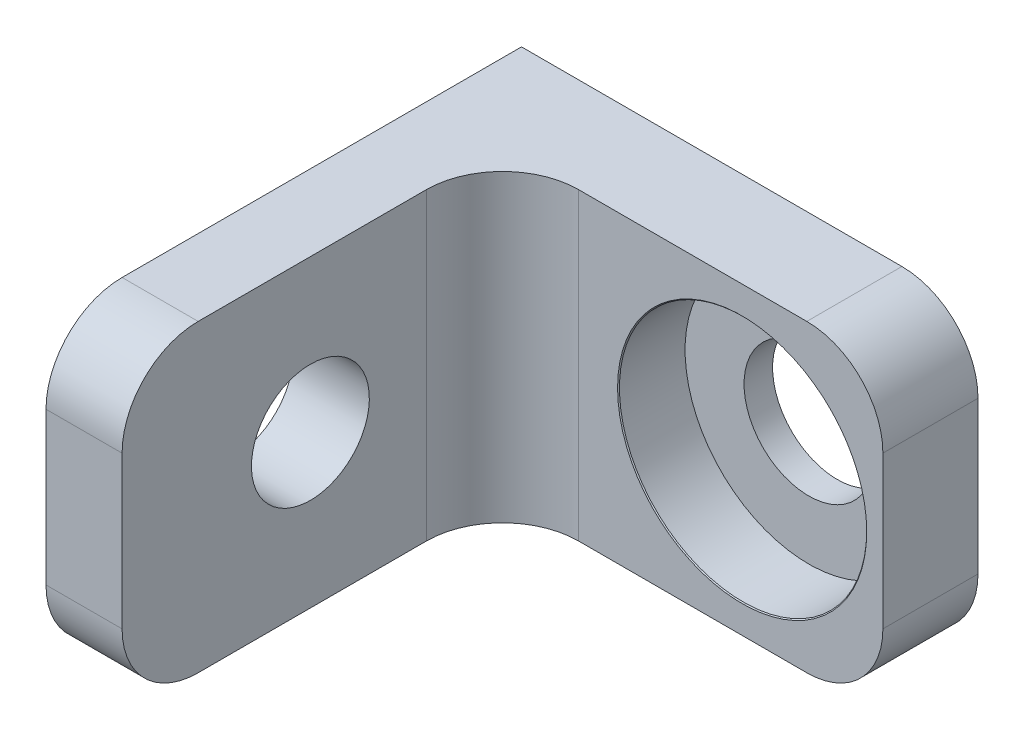
ISO-10303-21;
HEADER;
FILE_DESCRIPTION(('STEP AP214'),'2;1');
FILE_NAME('part.step','',(''),(''),'','','');
FILE_SCHEMA(('AUTOMOTIVE_DESIGN { 1 0 10303 214 1 1 1 1 }'));
ENDSEC;
DATA;
#1=APPLICATION_CONTEXT('core data for automotive mechanical design processes');
#2=APPLICATION_PROTOCOL_DEFINITION('international standard','automotive_design',2000,#1);
#3=PRODUCT_CONTEXT('',#1,'mechanical');
#4=PRODUCT('Part','Part','',(#3));
#5=PRODUCT_RELATED_PRODUCT_CATEGORY('part','',(#4));
#6=PRODUCT_DEFINITION_FORMATION('','',#4);
#7=PRODUCT_DEFINITION_CONTEXT('part definition',#1,'design');
#8=PRODUCT_DEFINITION('design','',#6,#7);
#9=PRODUCT_DEFINITION_SHAPE('','',#8);
#10=(LENGTH_UNIT() NAMED_UNIT(*) SI_UNIT(.MILLI.,.METRE.));
#11=(NAMED_UNIT(*) PLANE_ANGLE_UNIT() SI_UNIT($,.RADIAN.));
#12=(NAMED_UNIT(*) SI_UNIT($,.STERADIAN.) SOLID_ANGLE_UNIT());
#13=UNCERTAINTY_MEASURE_WITH_UNIT(LENGTH_MEASURE(1.E-05),#10,'distance_accuracy_value','');
#14=(GEOMETRIC_REPRESENTATION_CONTEXT(3) GLOBAL_UNCERTAINTY_ASSIGNED_CONTEXT((#13)) GLOBAL_UNIT_ASSIGNED_CONTEXT((#10,
#11,#12)) REPRESENTATION_CONTEXT('',''));
#15=CARTESIAN_POINT('',(0.,0.,0.));
#16=DIRECTION('',(0.,0.,1.));
#17=DIRECTION('',(1.,0.,0.));
#18=AXIS2_PLACEMENT_3D('',#15,#16,#17);
#19=CARTESIAN_POINT('',(-12.,6.,2.5));
#20=DIRECTION('',(1.,0.,0.));
#21=DIRECTION('',(0.,1.,0.));
#22=AXIS2_PLACEMENT_3D('',#19,#20,#21);
#23=PLANE('',#22);
#24=CARTESIAN_POINT('',(-12.,2.,7.55));
#25=DIRECTION('',(1.,0.,0.));
#26=DIRECTION('',(0.,1.,0.));
#27=AXIS2_PLACEMENT_3D('',#24,#25,#26);
#28=CIRCLE('',#27,1.55);
#29=CARTESIAN_POINT('',(-12.,3.55,7.55));
#30=VERTEX_POINT('',#29);
#31=EDGE_CURVE('E297',#30,#30,#28,.F.);
#32=ORIENTED_EDGE('',*,*,#31,.F.);
#33=EDGE_LOOP('',(#32));
#34=FACE_BOUND('',#33,.T.);
#35=DIRECTION('',(0.,0.,-1.));
#36=VECTOR('',#35,1.);
#37=CARTESIAN_POINT('',(-12.,-2.,2.5));
#38=LINE('',#37,#36);
#39=CARTESIAN_POINT('',(-12.,-2.,10.5));
#40=VERTEX_POINT('',#39);
#41=CARTESIAN_POINT('',(-12.,-2.,0.));
#42=VERTEX_POINT('',#41);
#43=EDGE_CURVE('E120',#40,#42,#38,.T.);
#44=ORIENTED_EDGE('',*,*,#43,.F.);
#45=CARTESIAN_POINT('',(-12.,0.,10.5));
#46=DIRECTION('',(1.,0.,0.));
#47=DIRECTION('',(0.,1.,0.));
#48=AXIS2_PLACEMENT_3D('',#45,#46,#47);
#49=CIRCLE('',#48,2.);
#50=CARTESIAN_POINT('',(-12.,0.,12.5));
#51=VERTEX_POINT('',#50);
#52=EDGE_CURVE('E11',#40,#51,#49,.F.);
#53=ORIENTED_EDGE('',*,*,#52,.T.);
#54=DIRECTION('',(0.,-1.,0.));
#55=VECTOR('',#54,1.);
#56=CARTESIAN_POINT('',(-12.,6.,12.5));
#57=LINE('',#56,#55);
#58=CARTESIAN_POINT('',(-12.,4.,12.5));
#59=VERTEX_POINT('',#58);
#60=EDGE_CURVE('E196',#59,#51,#57,.T.);
#61=ORIENTED_EDGE('',*,*,#60,.F.);
#62=CARTESIAN_POINT('',(-12.,4.,10.5));
#63=DIRECTION('',(1.,0.,0.));
#64=DIRECTION('',(0.,1.,0.));
#65=AXIS2_PLACEMENT_3D('',#62,#63,#64);
#66=CIRCLE('',#65,2.);
#67=CARTESIAN_POINT('',(-12.,6.,10.5));
#68=VERTEX_POINT('',#67);
#69=EDGE_CURVE('E43',#59,#68,#66,.F.);
#70=ORIENTED_EDGE('',*,*,#69,.T.);
#71=DIRECTION('',(0.,0.,-1.));
#72=VECTOR('',#71,1.);
#73=CARTESIAN_POINT('',(-12.,6.,2.5));
#74=LINE('',#73,#72);
#75=CARTESIAN_POINT('',(-12.,6.,0.));
#76=VERTEX_POINT('',#75);
#77=EDGE_CURVE('E131',#68,#76,#74,.T.);
#78=ORIENTED_EDGE('',*,*,#77,.T.);
#79=DIRECTION('',(0.,-1.,0.));
#80=VECTOR('',#79,1.);
#81=CARTESIAN_POINT('',(-12.,6.,0.));
#82=LINE('',#81,#80);
#83=EDGE_CURVE('E137',#76,#42,#82,.T.);
#84=ORIENTED_EDGE('',*,*,#83,.T.);
#85=EDGE_LOOP('',(#44,#53,#61,#70,#78,#84));
#86=FACE_BOUND('',#85,.T.);
#87=ADVANCED_FACE('F35',(#34,#86),#23,.F.);
#88=CARTESIAN_POINT('',(-12.,-2.,2.5));
#89=DIRECTION('',(0.,1.,0.));
#90=DIRECTION('',(0.,0.,1.));
#91=AXIS2_PLACEMENT_3D('',#88,#89,#90);
#92=PLANE('',#91);
#93=DIRECTION('',(1.,0.,0.));
#94=VECTOR('',#93,1.);
#95=CARTESIAN_POINT('',(-12.,-2.,0.));
#96=LINE('',#95,#94);
#97=CARTESIAN_POINT('',(-2.,-2.,0.));
#98=VERTEX_POINT('',#97);
#99=EDGE_CURVE('E123',#42,#98,#96,.T.);
#100=ORIENTED_EDGE('',*,*,#99,.T.);
#101=DIRECTION('',(0.,0.,-1.));
#102=VECTOR('',#101,1.);
#103=CARTESIAN_POINT('',(-2.,-2.,2.5));
#104=LINE('',#103,#102);
#105=CARTESIAN_POINT('',(-2.,-2.,2.5));
#106=VERTEX_POINT('',#105);
#107=EDGE_CURVE('E186',#98,#106,#104,.F.);
#108=ORIENTED_EDGE('',*,*,#107,.T.);
#109=DIRECTION('',(1.,0.,0.));
#110=VECTOR('',#109,1.);
#111=CARTESIAN_POINT('',(-12.,-2.,2.5));
#112=LINE('',#111,#110);
#113=CARTESIAN_POINT('',(-8.,-2.,2.5));
#114=VERTEX_POINT('',#113);
#115=EDGE_CURVE('E156',#114,#106,#112,.T.);
#116=ORIENTED_EDGE('',*,*,#115,.F.);
#117=CARTESIAN_POINT('',(-8.,-2.,4.5));
#118=DIRECTION('',(0.,1.,0.));
#119=DIRECTION('',(0.,0.,1.));
#120=AXIS2_PLACEMENT_3D('',#117,#118,#119);
#121=CIRCLE('',#120,2.);
#122=CARTESIAN_POINT('',(-10.,-2.,4.5));
#123=VERTEX_POINT('',#122);
#124=EDGE_CURVE('E165',#114,#123,#121,.T.);
#125=ORIENTED_EDGE('',*,*,#124,.T.);
#126=DIRECTION('',(0.,0.,-1.));
#127=VECTOR('',#126,1.);
#128=CARTESIAN_POINT('',(-10.,-2.,12.5));
#129=LINE('',#128,#127);
#130=CARTESIAN_POINT('',(-10.,-2.,10.5));
#131=VERTEX_POINT('',#130);
#132=EDGE_CURVE('E144',#131,#123,#129,.T.);
#133=ORIENTED_EDGE('',*,*,#132,.F.);
#134=DIRECTION('',(1.,0.,0.));
#135=VECTOR('',#134,1.);
#136=CARTESIAN_POINT('',(-12.,-2.,10.5));
#137=LINE('',#136,#135);
#138=EDGE_CURVE('E126',#131,#40,#137,.F.);
#139=ORIENTED_EDGE('',*,*,#138,.T.);
#140=ORIENTED_EDGE('',*,*,#43,.T.);
#141=EDGE_LOOP('',(#100,#108,#116,#125,#133,#139,#140));
#142=FACE_BOUND('',#141,.T.);
#143=ADVANCED_FACE('F122',(#142),#92,.F.);
#144=CARTESIAN_POINT('',(0.,6.,2.5));
#145=DIRECTION('',(-1.,0.,0.));
#146=DIRECTION('',(0.,-1.,0.));
#147=AXIS2_PLACEMENT_3D('',#144,#145,#146);
#148=PLANE('',#147);
#149=DIRECTION('',(0.,1.,0.));
#150=VECTOR('',#149,1.);
#151=CARTESIAN_POINT('',(0.,6.,0.));
#152=LINE('',#151,#150);
#153=CARTESIAN_POINT('',(0.,0.,0.));
#154=VERTEX_POINT('',#153);
#155=CARTESIAN_POINT('',(0.,4.,0.));
#156=VERTEX_POINT('',#155);
#157=EDGE_CURVE('E140',#154,#156,#152,.T.);
#158=ORIENTED_EDGE('',*,*,#157,.T.);
#159=DIRECTION('',(0.,0.,-1.));
#160=VECTOR('',#159,1.);
#161=CARTESIAN_POINT('',(0.,4.,2.5));
#162=LINE('',#161,#160);
#163=CARTESIAN_POINT('',(0.,4.,2.5));
#164=VERTEX_POINT('',#163);
#165=EDGE_CURVE('E179',#156,#164,#162,.F.);
#166=ORIENTED_EDGE('',*,*,#165,.T.);
#167=DIRECTION('',(0.,1.,0.));
#168=VECTOR('',#167,1.);
#169=CARTESIAN_POINT('',(0.,6.,2.5));
#170=LINE('',#169,#168);
#171=CARTESIAN_POINT('',(0.,0.,2.5));
#172=VERTEX_POINT('',#171);
#173=EDGE_CURVE('E213',#172,#164,#170,.T.);
#174=ORIENTED_EDGE('',*,*,#173,.F.);
#175=DIRECTION('',(0.,0.,-1.));
#176=VECTOR('',#175,1.);
#177=CARTESIAN_POINT('',(0.,0.,2.5));
#178=LINE('',#177,#176);
#179=EDGE_CURVE('E176',#172,#154,#178,.T.);
#180=ORIENTED_EDGE('',*,*,#179,.T.);
#181=EDGE_LOOP('',(#158,#166,#174,#180));
#182=FACE_BOUND('',#181,.T.);
#183=ADVANCED_FACE('F232',(#182),#148,.F.);
#184=CARTESIAN_POINT('',(-12.,6.,2.5));
#185=DIRECTION('',(0.,-1.,0.));
#186=DIRECTION('',(0.,0.,-1.));
#187=AXIS2_PLACEMENT_3D('',#184,#185,#186);
#188=PLANE('',#187);
#189=DIRECTION('',(-1.,0.,0.));
#190=VECTOR('',#189,1.);
#191=CARTESIAN_POINT('',(-12.,6.,2.5));
#192=LINE('',#191,#190);
#193=CARTESIAN_POINT('',(-2.,6.,2.5));
#194=VERTEX_POINT('',#193);
#195=CARTESIAN_POINT('',(-8.,6.,2.5));
#196=VERTEX_POINT('',#195);
#197=EDGE_CURVE('E149',#194,#196,#192,.T.);
#198=ORIENTED_EDGE('',*,*,#197,.F.);
#199=DIRECTION('',(0.,0.,-1.));
#200=VECTOR('',#199,1.);
#201=CARTESIAN_POINT('',(-2.,6.,2.5));
#202=LINE('',#201,#200);
#203=CARTESIAN_POINT('',(-2.,6.,0.));
#204=VERTEX_POINT('',#203);
#205=EDGE_CURVE('E170',#194,#204,#202,.T.);
#206=ORIENTED_EDGE('',*,*,#205,.T.);
#207=DIRECTION('',(-1.,0.,0.));
#208=VECTOR('',#207,1.);
#209=CARTESIAN_POINT('',(-12.,6.,0.));
#210=LINE('',#209,#208);
#211=EDGE_CURVE('E154',#204,#76,#210,.T.);
#212=ORIENTED_EDGE('',*,*,#211,.T.);
#213=ORIENTED_EDGE('',*,*,#77,.F.);
#214=DIRECTION('',(-1.,0.,0.));
#215=VECTOR('',#214,1.);
#216=CARTESIAN_POINT('',(-10.,6.,10.5));
#217=LINE('',#216,#215);
#218=CARTESIAN_POINT('',(-10.,6.,10.5));
#219=VERTEX_POINT('',#218);
#220=EDGE_CURVE('E168',#68,#219,#217,.F.);
#221=ORIENTED_EDGE('',*,*,#220,.T.);
#222=DIRECTION('',(0.,0.,-1.));
#223=VECTOR('',#222,1.);
#224=CARTESIAN_POINT('',(-10.,6.,12.5));
#225=LINE('',#224,#223);
#226=CARTESIAN_POINT('',(-10.,6.,4.5));
#227=VERTEX_POINT('',#226);
#228=EDGE_CURVE('E146',#219,#227,#225,.T.);
#229=ORIENTED_EDGE('',*,*,#228,.T.);
#230=CARTESIAN_POINT('',(-8.,6.,4.5));
#231=DIRECTION('',(0.,-1.,0.));
#232=DIRECTION('',(0.,0.,-1.));
#233=AXIS2_PLACEMENT_3D('',#230,#231,#232);
#234=CIRCLE('',#233,2.);
#235=EDGE_CURVE('E162',#227,#196,#234,.T.);
#236=ORIENTED_EDGE('',*,*,#235,.T.);
#237=EDGE_LOOP('',(#198,#206,#212,#213,#221,#229,#236));
#238=FACE_BOUND('',#237,.T.);
#239=ADVANCED_FACE('F202',(#238),#188,.F.);
#240=CARTESIAN_POINT('',(0.,0.,2.5));
#241=DIRECTION('',(0.,0.,1.));
#242=DIRECTION('',(1.,0.,0.));
#243=AXIS2_PLACEMENT_3D('',#240,#241,#242);
#244=PLANE('',#243);
#245=CARTESIAN_POINT('',(-3.7,2.,2.5));
#246=DIRECTION('',(0.,0.,1.));
#247=DIRECTION('',(1.,0.,0.));
#248=AXIS2_PLACEMENT_3D('',#245,#246,#247);
#249=CIRCLE('',#248,3.275);
#250=CARTESIAN_POINT('',(-0.424999999999997,2.,2.5));
#251=VERTEX_POINT('',#250);
#252=EDGE_CURVE('E298',#251,#251,#249,.T.);
#253=ORIENTED_EDGE('',*,*,#252,.F.);
#254=EDGE_LOOP('',(#253));
#255=FACE_BOUND('',#254,.T.);
#256=ORIENTED_EDGE('',*,*,#173,.T.);
#257=CARTESIAN_POINT('',(-2.,4.,2.5));
#258=DIRECTION('',(0.,0.,1.));
#259=DIRECTION('',(1.,0.,0.));
#260=AXIS2_PLACEMENT_3D('',#257,#258,#259);
#261=CIRCLE('',#260,2.);
#262=EDGE_CURVE('E183',#164,#194,#261,.T.);
#263=ORIENTED_EDGE('',*,*,#262,.T.);
#264=ORIENTED_EDGE('',*,*,#197,.T.);
#265=DIRECTION('',(0.,1.,0.));
#266=VECTOR('',#265,1.);
#267=CARTESIAN_POINT('',(-8.,0.,2.5));
#268=LINE('',#267,#266);
#269=EDGE_CURVE('E160',#196,#114,#268,.F.);
#270=ORIENTED_EDGE('',*,*,#269,.T.);
#271=ORIENTED_EDGE('',*,*,#115,.T.);
#272=CARTESIAN_POINT('',(-2.,0.,2.5));
#273=DIRECTION('',(0.,0.,1.));
#274=DIRECTION('',(1.,0.,0.));
#275=AXIS2_PLACEMENT_3D('',#272,#273,#274);
#276=CIRCLE('',#275,2.);
#277=EDGE_CURVE('E181',#106,#172,#276,.T.);
#278=ORIENTED_EDGE('',*,*,#277,.T.);
#279=EDGE_LOOP('',(#256,#263,#264,#270,#271,#278));
#280=FACE_BOUND('',#279,.T.);
#281=ADVANCED_FACE('F218',(#255,#280),#244,.T.);
#282=CARTESIAN_POINT('',(0.,0.,0.));
#283=DIRECTION('',(0.,0.,1.));
#284=DIRECTION('',(1.,0.,0.));
#285=AXIS2_PLACEMENT_3D('',#282,#283,#284);
#286=PLANE('',#285);
#287=CARTESIAN_POINT('',(-3.7,2.,0.));
#288=DIRECTION('',(0.,0.,1.));
#289=DIRECTION('',(1.,0.,0.));
#290=AXIS2_PLACEMENT_3D('',#287,#288,#289);
#291=CIRCLE('',#290,1.7);
#292=CARTESIAN_POINT('',(-2.,2.,0.));
#293=VERTEX_POINT('',#292);
#294=EDGE_CURVE('E208',#293,#293,#291,.T.);
#295=ORIENTED_EDGE('',*,*,#294,.T.);
#296=EDGE_LOOP('',(#295));
#297=FACE_BOUND('',#296,.T.);
#298=ORIENTED_EDGE('',*,*,#211,.F.);
#299=CARTESIAN_POINT('',(-2.,4.,0.));
#300=DIRECTION('',(0.,0.,1.));
#301=DIRECTION('',(1.,0.,0.));
#302=AXIS2_PLACEMENT_3D('',#299,#300,#301);
#303=CIRCLE('',#302,2.);
#304=EDGE_CURVE('E174',#204,#156,#303,.F.);
#305=ORIENTED_EDGE('',*,*,#304,.T.);
#306=ORIENTED_EDGE('',*,*,#157,.F.);
#307=CARTESIAN_POINT('',(-2.,0.,0.));
#308=DIRECTION('',(0.,0.,1.));
#309=DIRECTION('',(1.,0.,0.));
#310=AXIS2_PLACEMENT_3D('',#307,#308,#309);
#311=CIRCLE('',#310,2.);
#312=EDGE_CURVE('E139',#154,#98,#311,.F.);
#313=ORIENTED_EDGE('',*,*,#312,.T.);
#314=ORIENTED_EDGE('',*,*,#99,.F.);
#315=ORIENTED_EDGE('',*,*,#83,.F.);
#316=EDGE_LOOP('',(#298,#305,#306,#313,#314,#315));
#317=FACE_BOUND('',#316,.T.);
#318=ADVANCED_FACE('F136',(#297,#317),#286,.F.);
#319=CARTESIAN_POINT('',(-10.,6.,12.5));
#320=DIRECTION('',(-1.,0.,0.));
#321=DIRECTION('',(0.,-1.,0.));
#322=AXIS2_PLACEMENT_3D('',#319,#320,#321);
#323=PLANE('',#322);
#324=CARTESIAN_POINT('',(-10.,2.,7.55));
#325=DIRECTION('',(1.,0.,0.));
#326=DIRECTION('',(0.,1.,0.));
#327=AXIS2_PLACEMENT_3D('',#324,#325,#326);
#328=CIRCLE('',#327,1.55);
#329=CARTESIAN_POINT('',(-10.,3.55,7.55));
#330=VERTEX_POINT('',#329);
#331=EDGE_CURVE('E295',#330,#330,#328,.T.);
#332=ORIENTED_EDGE('',*,*,#331,.F.);
#333=EDGE_LOOP('',(#332));
#334=FACE_BOUND('',#333,.T.);
#335=DIRECTION('',(0.,1.,0.));
#336=VECTOR('',#335,1.);
#337=CARTESIAN_POINT('',(-10.,6.,12.5));
#338=LINE('',#337,#336);
#339=CARTESIAN_POINT('',(-10.,0.,12.5));
#340=VERTEX_POINT('',#339);
#341=CARTESIAN_POINT('',(-10.,4.,12.5));
#342=VERTEX_POINT('',#341);
#343=EDGE_CURVE('E205',#340,#342,#338,.T.);
#344=ORIENTED_EDGE('',*,*,#343,.F.);
#345=CARTESIAN_POINT('',(-10.,0.,10.5));
#346=DIRECTION('',(-1.,0.,0.));
#347=DIRECTION('',(0.,-1.,0.));
#348=AXIS2_PLACEMENT_3D('',#345,#346,#347);
#349=CIRCLE('',#348,2.);
#350=EDGE_CURVE('E58',#340,#131,#349,.F.);
#351=ORIENTED_EDGE('',*,*,#350,.T.);
#352=ORIENTED_EDGE('',*,*,#132,.T.);
#353=DIRECTION('',(0.,1.,0.));
#354=VECTOR('',#353,1.);
#355=CARTESIAN_POINT('',(-10.,6.,4.5));
#356=LINE('',#355,#354);
#357=EDGE_CURVE('E130',#123,#227,#356,.T.);
#358=ORIENTED_EDGE('',*,*,#357,.T.);
#359=ORIENTED_EDGE('',*,*,#228,.F.);
#360=CARTESIAN_POINT('',(-10.,4.,10.5));
#361=DIRECTION('',(-1.,0.,0.));
#362=DIRECTION('',(0.,-1.,0.));
#363=AXIS2_PLACEMENT_3D('',#360,#361,#362);
#364=CIRCLE('',#363,2.);
#365=EDGE_CURVE('E50',#219,#342,#364,.F.);
#366=ORIENTED_EDGE('',*,*,#365,.T.);
#367=EDGE_LOOP('',(#344,#351,#352,#358,#359,#366));
#368=FACE_BOUND('',#367,.T.);
#369=ADVANCED_FACE('F261',(#334,#368),#323,.F.);
#370=CARTESIAN_POINT('',(0.,0.,12.5));
#371=DIRECTION('',(0.,0.,1.));
#372=DIRECTION('',(1.,0.,0.));
#373=AXIS2_PLACEMENT_3D('',#370,#371,#372);
#374=PLANE('',#373);
#375=ORIENTED_EDGE('',*,*,#60,.T.);
#376=DIRECTION('',(1.,0.,0.));
#377=VECTOR('',#376,1.);
#378=CARTESIAN_POINT('',(-10.,0.,12.5));
#379=LINE('',#378,#377);
#380=EDGE_CURVE('E191',#51,#340,#379,.T.);
#381=ORIENTED_EDGE('',*,*,#380,.T.);
#382=ORIENTED_EDGE('',*,*,#343,.T.);
#383=DIRECTION('',(-1.,0.,0.));
#384=VECTOR('',#383,1.);
#385=CARTESIAN_POINT('',(-12.,4.,12.5));
#386=LINE('',#385,#384);
#387=EDGE_CURVE('E188',#342,#59,#386,.T.);
#388=ORIENTED_EDGE('',*,*,#387,.T.);
#389=EDGE_LOOP('',(#375,#381,#382,#388));
#390=FACE_BOUND('',#389,.T.);
#391=ADVANCED_FACE('F204',(#390),#374,.T.);
#392=CARTESIAN_POINT('',(-3.7,2.,2.5));
#393=DIRECTION('',(0.,0.,1.));
#394=DIRECTION('',(1.,0.,0.));
#395=AXIS2_PLACEMENT_3D('',#392,#393,#394);
#396=CYLINDRICAL_SURFACE('',#395,1.7);
#397=ORIENTED_EDGE('',*,*,#294,.F.);
#398=EDGE_LOOP('',(#397));
#399=FACE_BOUND('',#398,.T.);
#400=CARTESIAN_POINT('',(-3.7,2.,0.75));
#401=DIRECTION('',(0.,0.,1.));
#402=DIRECTION('',(1.,0.,0.));
#403=AXIS2_PLACEMENT_3D('',#400,#401,#402);
#404=CIRCLE('',#403,1.7);
#405=CARTESIAN_POINT('',(-2.,2.,0.75));
#406=VERTEX_POINT('',#405);
#407=EDGE_CURVE('E310',#406,#406,#404,.T.);
#408=ORIENTED_EDGE('',*,*,#407,.T.);
#409=EDGE_LOOP('',(#408));
#410=FACE_BOUND('',#409,.T.);
#411=ADVANCED_FACE('F271',(#399,#410),#396,.F.);
#412=CARTESIAN_POINT('',(-0.449999999999997,2.,0.75));
#413=DIRECTION('',(0.,0.,-1.));
#414=DIRECTION('',(-1.,0.,0.));
#415=AXIS2_PLACEMENT_3D('',#412,#413,#414);
#416=PLANE('',#415);
#417=ORIENTED_EDGE('',*,*,#407,.F.);
#418=EDGE_LOOP('',(#417));
#419=FACE_BOUND('',#418,.T.);
#420=CARTESIAN_POINT('',(-3.7,2.,0.75));
#421=DIRECTION('',(0.,0.,1.));
#422=DIRECTION('',(1.,0.,0.));
#423=AXIS2_PLACEMENT_3D('',#420,#421,#422);
#424=CIRCLE('',#423,3.25);
#425=CARTESIAN_POINT('',(-0.449999999999997,2.,0.75));
#426=VERTEX_POINT('',#425);
#427=EDGE_CURVE('E307',#426,#426,#424,.T.);
#428=ORIENTED_EDGE('',*,*,#427,.T.);
#429=EDGE_LOOP('',(#428));
#430=FACE_BOUND('',#429,.T.);
#431=ADVANCED_FACE('F274',(#419,#430),#416,.F.);
#432=CARTESIAN_POINT('',(-3.7,2.,2.5));
#433=DIRECTION('',(0.,0.,1.));
#434=DIRECTION('',(1.,0.,0.));
#435=AXIS2_PLACEMENT_3D('',#432,#433,#434);
#436=CYLINDRICAL_SURFACE('',#435,3.25);
#437=ORIENTED_EDGE('',*,*,#427,.F.);
#438=EDGE_LOOP('',(#437));
#439=FACE_BOUND('',#438,.T.);
#440=CARTESIAN_POINT('',(-3.7,2.,2.47500000000001));
#441=DIRECTION('',(0.,0.,1.));
#442=DIRECTION('',(1.,0.,0.));
#443=AXIS2_PLACEMENT_3D('',#440,#441,#442);
#444=CIRCLE('',#443,3.25);
#445=CARTESIAN_POINT('',(-0.450000000000002,2.,2.47500000000001));
#446=VERTEX_POINT('',#445);
#447=EDGE_CURVE('E301',#446,#446,#444,.T.);
#448=ORIENTED_EDGE('',*,*,#447,.T.);
#449=EDGE_LOOP('',(#448));
#450=FACE_BOUND('',#449,.T.);
#451=ADVANCED_FACE('F278',(#439,#450),#436,.F.);
#452=CARTESIAN_POINT('',(-3.7,2.,2.5));
#453=DIRECTION('',(0.,0.,1.));
#454=DIRECTION('',(1.,0.,0.));
#455=AXIS2_PLACEMENT_3D('',#452,#453,#454);
#456=CONICAL_SURFACE('',#455,3.275,0.785398163397622);
#457=ORIENTED_EDGE('',*,*,#447,.F.);
#458=EDGE_LOOP('',(#457));
#459=FACE_BOUND('',#458,.T.);
#460=ORIENTED_EDGE('',*,*,#252,.T.);
#461=EDGE_LOOP('',(#460));
#462=FACE_BOUND('',#461,.T.);
#463=ADVANCED_FACE('F244',(#459,#462),#456,.F.);
#464=CARTESIAN_POINT('',(-8.,6.,4.5));
#465=DIRECTION('',(0.,1.,0.));
#466=DIRECTION('',(-1.,0.,0.));
#467=AXIS2_PLACEMENT_3D('',#464,#465,#466);
#468=CYLINDRICAL_SURFACE('',#467,2.);
#469=ORIENTED_EDGE('',*,*,#124,.F.);
#470=ORIENTED_EDGE('',*,*,#269,.F.);
#471=ORIENTED_EDGE('',*,*,#235,.F.);
#472=ORIENTED_EDGE('',*,*,#357,.F.);
#473=EDGE_LOOP('',(#469,#470,#471,#472));
#474=FACE_BOUND('',#473,.T.);
#475=ADVANCED_FACE('F226',(#474),#468,.F.);
#476=CARTESIAN_POINT('',(-2.,4.,2.5));
#477=DIRECTION('',(0.,0.,-1.));
#478=DIRECTION('',(-1.,0.,0.));
#479=AXIS2_PLACEMENT_3D('',#476,#477,#478);
#480=CYLINDRICAL_SURFACE('',#479,2.);
#481=ORIENTED_EDGE('',*,*,#262,.F.);
#482=ORIENTED_EDGE('',*,*,#165,.F.);
#483=ORIENTED_EDGE('',*,*,#304,.F.);
#484=ORIENTED_EDGE('',*,*,#205,.F.);
#485=EDGE_LOOP('',(#481,#482,#483,#484));
#486=FACE_BOUND('',#485,.T.);
#487=ADVANCED_FACE('F235',(#486),#480,.T.);
#488=CARTESIAN_POINT('',(-2.,0.,2.5));
#489=DIRECTION('',(0.,0.,-1.));
#490=DIRECTION('',(-1.,0.,0.));
#491=AXIS2_PLACEMENT_3D('',#488,#489,#490);
#492=CYLINDRICAL_SURFACE('',#491,2.);
#493=ORIENTED_EDGE('',*,*,#277,.F.);
#494=ORIENTED_EDGE('',*,*,#107,.F.);
#495=ORIENTED_EDGE('',*,*,#312,.F.);
#496=ORIENTED_EDGE('',*,*,#179,.F.);
#497=EDGE_LOOP('',(#493,#494,#495,#496));
#498=FACE_BOUND('',#497,.T.);
#499=ADVANCED_FACE('F230',(#498),#492,.T.);
#500=CARTESIAN_POINT('',(0.,0.,10.5));
#501=DIRECTION('',(-1.,0.,0.));
#502=DIRECTION('',(0.,0.,1.));
#503=AXIS2_PLACEMENT_3D('',#500,#501,#502);
#504=CYLINDRICAL_SURFACE('',#503,2.);
#505=ORIENTED_EDGE('',*,*,#52,.F.);
#506=ORIENTED_EDGE('',*,*,#138,.F.);
#507=ORIENTED_EDGE('',*,*,#350,.F.);
#508=ORIENTED_EDGE('',*,*,#380,.F.);
#509=EDGE_LOOP('',(#505,#506,#507,#508));
#510=FACE_BOUND('',#509,.T.);
#511=ADVANCED_FACE('F242',(#510),#504,.T.);
#512=CARTESIAN_POINT('',(0.,4.,10.5));
#513=DIRECTION('',(1.,0.,0.));
#514=DIRECTION('',(0.,0.,-1.));
#515=AXIS2_PLACEMENT_3D('',#512,#513,#514);
#516=CYLINDRICAL_SURFACE('',#515,2.);
#517=ORIENTED_EDGE('',*,*,#365,.F.);
#518=ORIENTED_EDGE('',*,*,#220,.F.);
#519=ORIENTED_EDGE('',*,*,#69,.F.);
#520=ORIENTED_EDGE('',*,*,#387,.F.);
#521=EDGE_LOOP('',(#517,#518,#519,#520));
#522=FACE_BOUND('',#521,.T.);
#523=ADVANCED_FACE('F37',(#522),#516,.T.);
#524=CARTESIAN_POINT('',(-12.001,2.,7.55));
#525=DIRECTION('',(1.,0.,0.));
#526=DIRECTION('',(0.,1.,0.));
#527=AXIS2_PLACEMENT_3D('',#524,#525,#526);
#528=CYLINDRICAL_SURFACE('',#527,1.55);
#529=ORIENTED_EDGE('',*,*,#331,.T.);
#530=EDGE_LOOP('',(#529));
#531=FACE_BOUND('',#530,.T.);
#532=ORIENTED_EDGE('',*,*,#31,.T.);
#533=EDGE_LOOP('',(#532));
#534=FACE_BOUND('',#533,.T.);
#535=ADVANCED_FACE('F286',(#531,#534),#528,.F.);
#536=CLOSED_SHELL('',(#87,#143,#183,#239,#281,#318,#369,#391,#411,#431,#451,#463,#475,#487,#499,
#511,#523,#535));
#537=MANIFOLD_SOLID_BREP('B2',#536);
#538=ADVANCED_BREP_SHAPE_REPRESENTATION('',(#18,#537),#14);
#539=SHAPE_DEFINITION_REPRESENTATION(#9,#538);
ENDSEC;
END-ISO-10303-21;
